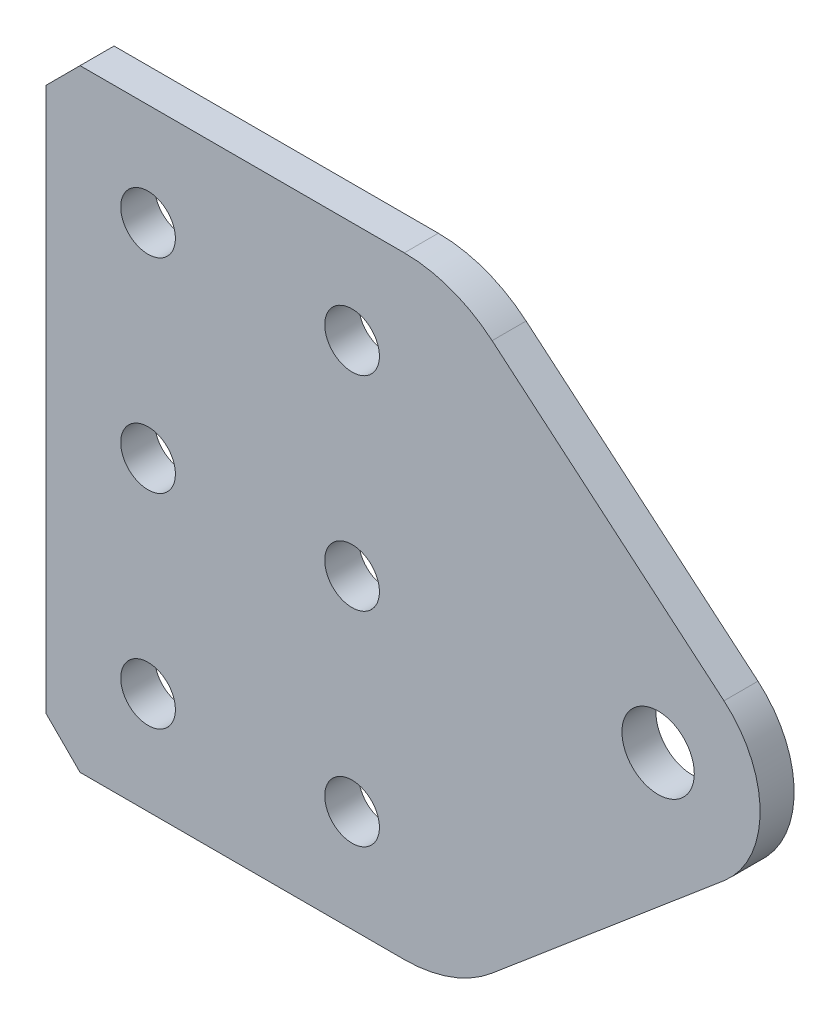
ISO-10303-21;
HEADER;
FILE_DESCRIPTION(('STEP AP214'),'2;1');
FILE_NAME('part.step','',(''),(''),'','','');
FILE_SCHEMA(('AUTOMOTIVE_DESIGN { 1 0 10303 214 1 1 1 1 }'));
ENDSEC;
DATA;
#1=APPLICATION_CONTEXT('core data for automotive mechanical design processes');
#2=APPLICATION_PROTOCOL_DEFINITION('international standard','automotive_design',2000,#1);
#3=PRODUCT_CONTEXT('',#1,'mechanical');
#4=PRODUCT('Part','Part','',(#3));
#5=PRODUCT_RELATED_PRODUCT_CATEGORY('part','',(#4));
#6=PRODUCT_DEFINITION_FORMATION('','',#4);
#7=PRODUCT_DEFINITION_CONTEXT('part definition',#1,'design');
#8=PRODUCT_DEFINITION('design','',#6,#7);
#9=PRODUCT_DEFINITION_SHAPE('','',#8);
#10=(LENGTH_UNIT() NAMED_UNIT(*) SI_UNIT(.MILLI.,.METRE.));
#11=(NAMED_UNIT(*) PLANE_ANGLE_UNIT() SI_UNIT($,.RADIAN.));
#12=(NAMED_UNIT(*) SI_UNIT($,.STERADIAN.) SOLID_ANGLE_UNIT());
#13=UNCERTAINTY_MEASURE_WITH_UNIT(LENGTH_MEASURE(1.E-05),#10,'distance_accuracy_value','');
#14=(GEOMETRIC_REPRESENTATION_CONTEXT(3) GLOBAL_UNCERTAINTY_ASSIGNED_CONTEXT((#13)) GLOBAL_UNIT_ASSIGNED_CONTEXT((#10,
#11,#12)) REPRESENTATION_CONTEXT('',''));
#15=CARTESIAN_POINT('',(0.,0.,0.));
#16=DIRECTION('',(0.,0.,1.));
#17=DIRECTION('',(1.,0.,0.));
#18=AXIS2_PLACEMENT_3D('',#15,#16,#17);
#19=CARTESIAN_POINT('',(33.4514773719376,12.7,3.175));
#20=DIRECTION('',(0.,0.,1.));
#21=DIRECTION('',(1.,0.,0.));
#22=AXIS2_PLACEMENT_3D('',#19,#20,#21);
#23=PLANE('',#22);
#24=CARTESIAN_POINT('',(28.575,28.575,3.175));
#25=DIRECTION('',(0.,0.,1.));
#26=DIRECTION('',(1.,0.,0.));
#27=AXIS2_PLACEMENT_3D('',#24,#25,#26);
#28=CIRCLE('',#27,2.5527);
#29=CARTESIAN_POINT('',(31.1277,28.575,3.175));
#30=VERTEX_POINT('',#29);
#31=EDGE_CURVE('E408',#30,#30,#28,.T.);
#32=ORIENTED_EDGE('',*,*,#31,.F.);
#33=EDGE_LOOP('',(#32));
#34=FACE_BOUND('',#33,.T.);
#35=CARTESIAN_POINT('',(9.525,28.575,3.175));
#36=DIRECTION('',(0.,0.,1.));
#37=DIRECTION('',(1.,0.,0.));
#38=AXIS2_PLACEMENT_3D('',#35,#36,#37);
#39=CIRCLE('',#38,2.5527);
#40=CARTESIAN_POINT('',(12.0777,28.575,3.175));
#41=VERTEX_POINT('',#40);
#42=EDGE_CURVE('E402',#41,#41,#39,.T.);
#43=ORIENTED_EDGE('',*,*,#42,.F.);
#44=EDGE_LOOP('',(#43));
#45=FACE_BOUND('',#44,.T.);
#46=CARTESIAN_POINT('',(9.525,47.625,3.175));
#47=DIRECTION('',(0.,0.,1.));
#48=DIRECTION('',(1.,0.,0.));
#49=AXIS2_PLACEMENT_3D('',#46,#47,#48);
#50=CIRCLE('',#49,2.5527);
#51=CARTESIAN_POINT('',(12.0777,47.625,3.175));
#52=VERTEX_POINT('',#51);
#53=EDGE_CURVE('E405',#52,#52,#50,.T.);
#54=ORIENTED_EDGE('',*,*,#53,.F.);
#55=EDGE_LOOP('',(#54));
#56=FACE_BOUND('',#55,.T.);
#57=CARTESIAN_POINT('',(28.575,47.625,3.175));
#58=DIRECTION('',(0.,0.,1.));
#59=DIRECTION('',(1.,0.,0.));
#60=AXIS2_PLACEMENT_3D('',#57,#58,#59);
#61=CIRCLE('',#60,2.5527);
#62=CARTESIAN_POINT('',(31.1277,47.625,3.175));
#63=VERTEX_POINT('',#62);
#64=EDGE_CURVE('E417',#63,#63,#61,.T.);
#65=ORIENTED_EDGE('',*,*,#64,.F.);
#66=EDGE_LOOP('',(#65));
#67=FACE_BOUND('',#66,.T.);
#68=CARTESIAN_POINT('',(28.575,9.525,3.175));
#69=DIRECTION('',(0.,0.,1.));
#70=DIRECTION('',(1.,0.,0.));
#71=AXIS2_PLACEMENT_3D('',#68,#69,#70);
#72=CIRCLE('',#71,2.5527);
#73=CARTESIAN_POINT('',(31.1277,9.525,3.175));
#74=VERTEX_POINT('',#73);
#75=EDGE_CURVE('E423',#74,#74,#72,.T.);
#76=ORIENTED_EDGE('',*,*,#75,.F.);
#77=EDGE_LOOP('',(#76));
#78=FACE_BOUND('',#77,.T.);
#79=CARTESIAN_POINT('',(9.525,9.525,3.175));
#80=DIRECTION('',(0.,0.,1.));
#81=DIRECTION('',(1.,0.,0.));
#82=AXIS2_PLACEMENT_3D('',#79,#80,#81);
#83=CIRCLE('',#82,2.5527);
#84=CARTESIAN_POINT('',(12.0777,9.525,3.175));
#85=VERTEX_POINT('',#84);
#86=EDGE_CURVE('E429',#85,#85,#83,.T.);
#87=ORIENTED_EDGE('',*,*,#86,.F.);
#88=EDGE_LOOP('',(#87));
#89=FACE_BOUND('',#88,.T.);
#90=DIRECTION('',(0.,-1.,0.));
#91=VECTOR('',#90,1.);
#92=CARTESIAN_POINT('',(0.,57.15,3.175));
#93=LINE('',#92,#91);
#94=CARTESIAN_POINT('',(0.,53.975,3.175));
#95=VERTEX_POINT('',#94);
#96=CARTESIAN_POINT('',(0.,3.17500000000001,3.175));
#97=VERTEX_POINT('',#96);
#98=EDGE_CURVE('E129',#95,#97,#93,.T.);
#99=ORIENTED_EDGE('',*,*,#98,.T.);
#100=DIRECTION('',(-0.707106781186547,0.707106781186548,0.));
#101=VECTOR('',#100,1.);
#102=CARTESIAN_POINT('',(11.9632386859688,-8.7882386859688,3.175));
#103=LINE('',#102,#101);
#104=CARTESIAN_POINT('',(3.175,0.,3.175));
#105=VERTEX_POINT('',#104);
#106=EDGE_CURVE('E49',#97,#105,#103,.F.);
#107=ORIENTED_EDGE('',*,*,#106,.T.);
#108=DIRECTION('',(1.,0.,0.));
#109=VECTOR('',#108,1.);
#110=CARTESIAN_POINT('',(0.,0.,3.175));
#111=LINE('',#110,#109);
#112=CARTESIAN_POINT('',(33.4514773719376,0.,3.175));
#113=VERTEX_POINT('',#112);
#114=EDGE_CURVE('E119',#105,#113,#111,.T.);
#115=ORIENTED_EDGE('',*,*,#114,.T.);
#116=CARTESIAN_POINT('',(33.4514773719376,12.7,3.175));
#117=DIRECTION('',(0.,0.,1.));
#118=DIRECTION('',(1.,0.,0.));
#119=AXIS2_PLACEMENT_3D('',#116,#117,#118);
#120=CIRCLE('',#119,12.7);
#121=CARTESIAN_POINT('',(41.6501136439952,3.00090915196161,3.175));
#122=VERTEX_POINT('',#121);
#123=EDGE_CURVE('E123',#113,#122,#120,.T.);
#124=ORIENTED_EDGE('',*,*,#123,.T.);
#125=DIRECTION('',(0.763707940790424,0.645561911185636,0.));
#126=VECTOR('',#125,1.);
#127=CARTESIAN_POINT('',(41.6501136439952,3.00090915196162,3.175));
#128=LINE('',#127,#126);
#129=CARTESIAN_POINT('',(63.2989772040432,21.3006818639712,3.175));
#130=VERTEX_POINT('',#129);
#131=EDGE_CURVE('E144',#122,#130,#128,.T.);
#132=ORIENTED_EDGE('',*,*,#131,.T.);
#133=CARTESIAN_POINT('',(57.15,28.575,3.175));
#134=DIRECTION('',(0.,0.,1.));
#135=DIRECTION('',(1.,0.,0.));
#136=AXIS2_PLACEMENT_3D('',#133,#134,#135);
#137=CIRCLE('',#136,9.52500000000001);
#138=CARTESIAN_POINT('',(63.2989772040432,35.8493181360288,3.175));
#139=VERTEX_POINT('',#138);
#140=EDGE_CURVE('E146',#130,#139,#137,.T.);
#141=ORIENTED_EDGE('',*,*,#140,.T.);
#142=DIRECTION('',(-0.763707940790424,0.645561911185636,0.));
#143=VECTOR('',#142,1.);
#144=CARTESIAN_POINT('',(63.2989772040432,35.8493181360288,3.175));
#145=LINE('',#144,#143);
#146=CARTESIAN_POINT('',(41.6501136439952,54.1490908480384,3.175));
#147=VERTEX_POINT('',#146);
#148=EDGE_CURVE('E151',#139,#147,#145,.T.);
#149=ORIENTED_EDGE('',*,*,#148,.T.);
#150=CARTESIAN_POINT('',(33.4514773719376,44.45,3.175));
#151=DIRECTION('',(0.,0.,1.));
#152=DIRECTION('',(1.,0.,0.));
#153=AXIS2_PLACEMENT_3D('',#150,#151,#152);
#154=CIRCLE('',#153,12.7);
#155=CARTESIAN_POINT('',(33.4514773719376,57.15,3.175));
#156=VERTEX_POINT('',#155);
#157=EDGE_CURVE('E153',#147,#156,#154,.T.);
#158=ORIENTED_EDGE('',*,*,#157,.T.);
#159=DIRECTION('',(-1.,0.,0.));
#160=VECTOR('',#159,1.);
#161=CARTESIAN_POINT('',(33.4514773719376,57.15,3.175));
#162=LINE('',#161,#160);
#163=CARTESIAN_POINT('',(3.17500000000002,57.15,3.175));
#164=VERTEX_POINT('',#163);
#165=EDGE_CURVE('E155',#156,#164,#162,.T.);
#166=ORIENTED_EDGE('',*,*,#165,.T.);
#167=DIRECTION('',(0.707106781186549,0.707106781186546,0.));
#168=VECTOR('',#167,1.);
#169=CARTESIAN_POINT('',(-3.91176131403111,50.0632386859689,3.175));
#170=LINE('',#169,#168);
#171=EDGE_CURVE('E195',#164,#95,#170,.F.);
#172=ORIENTED_EDGE('',*,*,#171,.T.);
#173=EDGE_LOOP('',(#99,#107,#115,#124,#132,#141,#149,#158,#166,#172));
#174=FACE_BOUND('',#173,.T.);
#175=CARTESIAN_POINT('',(57.15,28.575,3.175));
#176=DIRECTION('',(0.,0.,1.));
#177=DIRECTION('',(1.,0.,0.));
#178=AXIS2_PLACEMENT_3D('',#175,#176,#177);
#179=CIRCLE('',#178,3.3782);
#180=CARTESIAN_POINT('',(60.5282,28.575,3.175));
#181=VERTEX_POINT('',#180);
#182=EDGE_CURVE('E160',#181,#181,#179,.T.);
#183=ORIENTED_EDGE('',*,*,#182,.F.);
#184=EDGE_LOOP('',(#183));
#185=FACE_BOUND('',#184,.T.);
#186=ADVANCED_FACE('F40',(#34,#45,#56,#67,#78,#89,#174,#185),#23,.T.);
#187=CARTESIAN_POINT('',(33.4514773719376,12.7,0.));
#188=DIRECTION('',(0.,0.,1.));
#189=DIRECTION('',(1.,0.,0.));
#190=AXIS2_PLACEMENT_3D('',#187,#188,#189);
#191=PLANE('',#190);
#192=CARTESIAN_POINT('',(28.575,28.575,0.));
#193=DIRECTION('',(0.,0.,1.));
#194=DIRECTION('',(1.,0.,0.));
#195=AXIS2_PLACEMENT_3D('',#192,#193,#194);
#196=CIRCLE('',#195,2.5527);
#197=CARTESIAN_POINT('',(31.1277,28.575,0.));
#198=VERTEX_POINT('',#197);
#199=EDGE_CURVE('E403',#198,#198,#196,.T.);
#200=ORIENTED_EDGE('',*,*,#199,.T.);
#201=EDGE_LOOP('',(#200));
#202=FACE_BOUND('',#201,.T.);
#203=CARTESIAN_POINT('',(9.525,28.575,0.));
#204=DIRECTION('',(0.,0.,1.));
#205=DIRECTION('',(1.,0.,0.));
#206=AXIS2_PLACEMENT_3D('',#203,#204,#205);
#207=CIRCLE('',#206,2.5527);
#208=CARTESIAN_POINT('',(12.0777,28.575,0.));
#209=VERTEX_POINT('',#208);
#210=EDGE_CURVE('E399',#209,#209,#207,.T.);
#211=ORIENTED_EDGE('',*,*,#210,.T.);
#212=EDGE_LOOP('',(#211));
#213=FACE_BOUND('',#212,.T.);
#214=CARTESIAN_POINT('',(9.525,47.625,0.));
#215=DIRECTION('',(0.,0.,1.));
#216=DIRECTION('',(1.,0.,0.));
#217=AXIS2_PLACEMENT_3D('',#214,#215,#216);
#218=CIRCLE('',#217,2.5527);
#219=CARTESIAN_POINT('',(12.0777,47.625,0.));
#220=VERTEX_POINT('',#219);
#221=EDGE_CURVE('E414',#220,#220,#218,.T.);
#222=ORIENTED_EDGE('',*,*,#221,.T.);
#223=EDGE_LOOP('',(#222));
#224=FACE_BOUND('',#223,.T.);
#225=CARTESIAN_POINT('',(28.575,47.625,0.));
#226=DIRECTION('',(0.,0.,1.));
#227=DIRECTION('',(1.,0.,0.));
#228=AXIS2_PLACEMENT_3D('',#225,#226,#227);
#229=CIRCLE('',#228,2.5527);
#230=CARTESIAN_POINT('',(31.1277,47.625,0.));
#231=VERTEX_POINT('',#230);
#232=EDGE_CURVE('E420',#231,#231,#229,.T.);
#233=ORIENTED_EDGE('',*,*,#232,.T.);
#234=EDGE_LOOP('',(#233));
#235=FACE_BOUND('',#234,.T.);
#236=CARTESIAN_POINT('',(28.575,9.525,0.));
#237=DIRECTION('',(0.,0.,1.));
#238=DIRECTION('',(1.,0.,0.));
#239=AXIS2_PLACEMENT_3D('',#236,#237,#238);
#240=CIRCLE('',#239,2.5527);
#241=CARTESIAN_POINT('',(31.1277,9.525,0.));
#242=VERTEX_POINT('',#241);
#243=EDGE_CURVE('E426',#242,#242,#240,.T.);
#244=ORIENTED_EDGE('',*,*,#243,.T.);
#245=EDGE_LOOP('',(#244));
#246=FACE_BOUND('',#245,.T.);
#247=CARTESIAN_POINT('',(9.525,9.525,0.));
#248=DIRECTION('',(0.,0.,1.));
#249=DIRECTION('',(1.,0.,0.));
#250=AXIS2_PLACEMENT_3D('',#247,#248,#249);
#251=CIRCLE('',#250,2.5527);
#252=CARTESIAN_POINT('',(12.0777,9.525,0.));
#253=VERTEX_POINT('',#252);
#254=EDGE_CURVE('E432',#253,#253,#251,.T.);
#255=ORIENTED_EDGE('',*,*,#254,.T.);
#256=EDGE_LOOP('',(#255));
#257=FACE_BOUND('',#256,.T.);
#258=DIRECTION('',(1.,0.,0.));
#259=VECTOR('',#258,1.);
#260=CARTESIAN_POINT('',(0.,0.,0.));
#261=LINE('',#260,#259);
#262=CARTESIAN_POINT('',(3.175,0.,0.));
#263=VERTEX_POINT('',#262);
#264=CARTESIAN_POINT('',(33.4514773719376,0.,0.));
#265=VERTEX_POINT('',#264);
#266=EDGE_CURVE('E135',#263,#265,#261,.T.);
#267=ORIENTED_EDGE('',*,*,#266,.F.);
#268=DIRECTION('',(0.707106781186547,-0.707106781186548,0.));
#269=VECTOR('',#268,1.);
#270=CARTESIAN_POINT('',(3.175,0.,0.));
#271=LINE('',#270,#269);
#272=CARTESIAN_POINT('',(0.,3.17500000000001,0.));
#273=VERTEX_POINT('',#272);
#274=EDGE_CURVE('E189',#263,#273,#271,.F.);
#275=ORIENTED_EDGE('',*,*,#274,.T.);
#276=DIRECTION('',(0.,-1.,0.));
#277=VECTOR('',#276,1.);
#278=CARTESIAN_POINT('',(0.,57.15,0.));
#279=LINE('',#278,#277);
#280=CARTESIAN_POINT('',(0.,53.975,0.));
#281=VERTEX_POINT('',#280);
#282=EDGE_CURVE('E158',#281,#273,#279,.T.);
#283=ORIENTED_EDGE('',*,*,#282,.F.);
#284=DIRECTION('',(-0.707106781186549,-0.707106781186546,0.));
#285=VECTOR('',#284,1.);
#286=CARTESIAN_POINT('',(0.,53.975,0.));
#287=LINE('',#286,#285);
#288=CARTESIAN_POINT('',(3.17500000000002,57.15,0.));
#289=VERTEX_POINT('',#288);
#290=EDGE_CURVE('E187',#281,#289,#287,.F.);
#291=ORIENTED_EDGE('',*,*,#290,.T.);
#292=DIRECTION('',(-1.,0.,0.));
#293=VECTOR('',#292,1.);
#294=CARTESIAN_POINT('',(33.4514773719376,57.15,0.));
#295=LINE('',#294,#293);
#296=CARTESIAN_POINT('',(33.4514773719376,57.15,0.));
#297=VERTEX_POINT('',#296);
#298=EDGE_CURVE('E172',#297,#289,#295,.T.);
#299=ORIENTED_EDGE('',*,*,#298,.F.);
#300=CARTESIAN_POINT('',(33.4514773719376,44.45,0.));
#301=DIRECTION('',(0.,0.,1.));
#302=DIRECTION('',(1.,0.,0.));
#303=AXIS2_PLACEMENT_3D('',#300,#301,#302);
#304=CIRCLE('',#303,12.7);
#305=CARTESIAN_POINT('',(41.6501136439952,54.1490908480384,0.));
#306=VERTEX_POINT('',#305);
#307=EDGE_CURVE('E170',#306,#297,#304,.T.);
#308=ORIENTED_EDGE('',*,*,#307,.F.);
#309=DIRECTION('',(-0.763707940790424,0.645561911185636,0.));
#310=VECTOR('',#309,1.);
#311=CARTESIAN_POINT('',(63.2989772040432,35.8493181360288,0.));
#312=LINE('',#311,#310);
#313=CARTESIAN_POINT('',(63.2989772040432,35.8493181360288,0.));
#314=VERTEX_POINT('',#313);
#315=EDGE_CURVE('E168',#314,#306,#312,.T.);
#316=ORIENTED_EDGE('',*,*,#315,.F.);
#317=CARTESIAN_POINT('',(57.15,28.575,0.));
#318=DIRECTION('',(0.,0.,1.));
#319=DIRECTION('',(1.,0.,0.));
#320=AXIS2_PLACEMENT_3D('',#317,#318,#319);
#321=CIRCLE('',#320,9.52500000000001);
#322=CARTESIAN_POINT('',(63.2989772040432,21.3006818639712,0.));
#323=VERTEX_POINT('',#322);
#324=EDGE_CURVE('E166',#323,#314,#321,.T.);
#325=ORIENTED_EDGE('',*,*,#324,.F.);
#326=DIRECTION('',(0.763707940790424,0.645561911185636,0.));
#327=VECTOR('',#326,1.);
#328=CARTESIAN_POINT('',(41.6501136439952,3.00090915196162,0.));
#329=LINE('',#328,#327);
#330=CARTESIAN_POINT('',(41.6501136439952,3.00090915196161,0.));
#331=VERTEX_POINT('',#330);
#332=EDGE_CURVE('E164',#331,#323,#329,.T.);
#333=ORIENTED_EDGE('',*,*,#332,.F.);
#334=CARTESIAN_POINT('',(33.4514773719376,12.7,0.));
#335=DIRECTION('',(0.,0.,1.));
#336=DIRECTION('',(1.,0.,0.));
#337=AXIS2_PLACEMENT_3D('',#334,#335,#336);
#338=CIRCLE('',#337,12.7);
#339=EDGE_CURVE('E162',#265,#331,#338,.T.);
#340=ORIENTED_EDGE('',*,*,#339,.F.);
#341=EDGE_LOOP('',(#267,#275,#283,#291,#299,#308,#316,#325,#333,#340));
#342=FACE_BOUND('',#341,.T.);
#343=CARTESIAN_POINT('',(57.15,28.575,0.));
#344=DIRECTION('',(0.,0.,1.));
#345=DIRECTION('',(1.,0.,0.));
#346=AXIS2_PLACEMENT_3D('',#343,#344,#345);
#347=CIRCLE('',#346,3.3782);
#348=CARTESIAN_POINT('',(60.5282,28.575,0.));
#349=VERTEX_POINT('',#348);
#350=EDGE_CURVE('E435',#349,#349,#347,.T.);
#351=ORIENTED_EDGE('',*,*,#350,.T.);
#352=EDGE_LOOP('',(#351));
#353=FACE_BOUND('',#352,.T.);
#354=ADVANCED_FACE('F203',(#202,#213,#224,#235,#246,#257,#342,#353),#191,.F.);
#355=CARTESIAN_POINT('',(0.,57.15,3.175));
#356=DIRECTION('',(1.,0.,0.));
#357=DIRECTION('',(0.,0.,-1.));
#358=AXIS2_PLACEMENT_3D('',#355,#356,#357);
#359=PLANE('',#358);
#360=ORIENTED_EDGE('',*,*,#282,.T.);
#361=DIRECTION('',(0.,0.,1.));
#362=VECTOR('',#361,1.);
#363=CARTESIAN_POINT('',(0.,3.17500000000001,3.175));
#364=LINE('',#363,#362);
#365=EDGE_CURVE('E62',#273,#97,#364,.T.);
#366=ORIENTED_EDGE('',*,*,#365,.T.);
#367=ORIENTED_EDGE('',*,*,#98,.F.);
#368=DIRECTION('',(0.,0.,-1.));
#369=VECTOR('',#368,1.);
#370=CARTESIAN_POINT('',(0.,53.975,3.175));
#371=LINE('',#370,#369);
#372=EDGE_CURVE('E191',#95,#281,#371,.T.);
#373=ORIENTED_EDGE('',*,*,#372,.T.);
#374=EDGE_LOOP('',(#360,#366,#367,#373));
#375=FACE_BOUND('',#374,.T.);
#376=ADVANCED_FACE('F199',(#375),#359,.F.);
#377=CARTESIAN_POINT('',(0.,0.,3.175));
#378=DIRECTION('',(0.,1.,0.));
#379=DIRECTION('',(0.,0.,1.));
#380=AXIS2_PLACEMENT_3D('',#377,#378,#379);
#381=PLANE('',#380);
#382=ORIENTED_EDGE('',*,*,#114,.F.);
#383=DIRECTION('',(0.,0.,-1.));
#384=VECTOR('',#383,1.);
#385=CARTESIAN_POINT('',(3.175,0.,3.175));
#386=LINE('',#385,#384);
#387=EDGE_CURVE('E138',#105,#263,#386,.T.);
#388=ORIENTED_EDGE('',*,*,#387,.T.);
#389=ORIENTED_EDGE('',*,*,#266,.T.);
#390=DIRECTION('',(0.,0.,-1.));
#391=VECTOR('',#390,1.);
#392=CARTESIAN_POINT('',(33.4514773719376,0.,3.175));
#393=LINE('',#392,#391);
#394=EDGE_CURVE('E132',#113,#265,#393,.T.);
#395=ORIENTED_EDGE('',*,*,#394,.F.);
#396=EDGE_LOOP('',(#382,#388,#389,#395));
#397=FACE_BOUND('',#396,.T.);
#398=ADVANCED_FACE('F133',(#397),#381,.F.);
#399=CARTESIAN_POINT('',(33.4514773719376,12.7,3.175));
#400=DIRECTION('',(0.,0.,-1.));
#401=DIRECTION('',(-1.,0.,0.));
#402=AXIS2_PLACEMENT_3D('',#399,#400,#401);
#403=CYLINDRICAL_SURFACE('',#402,12.7);
#404=ORIENTED_EDGE('',*,*,#339,.T.);
#405=DIRECTION('',(0.,0.,-1.));
#406=VECTOR('',#405,1.);
#407=CARTESIAN_POINT('',(41.6501136439952,3.00090915196161,3.175));
#408=LINE('',#407,#406);
#409=EDGE_CURVE('E139',#122,#331,#408,.T.);
#410=ORIENTED_EDGE('',*,*,#409,.F.);
#411=ORIENTED_EDGE('',*,*,#123,.F.);
#412=ORIENTED_EDGE('',*,*,#394,.T.);
#413=EDGE_LOOP('',(#404,#410,#411,#412));
#414=FACE_BOUND('',#413,.T.);
#415=ADVANCED_FACE('F141',(#414),#403,.T.);
#416=CARTESIAN_POINT('',(41.6501136439952,3.00090915196162,3.175));
#417=DIRECTION('',(-0.645561911185636,0.763707940790424,0.));
#418=DIRECTION('',(-0.763707940790424,-0.645561911185636,0.));
#419=AXIS2_PLACEMENT_3D('',#416,#417,#418);
#420=PLANE('',#419);
#421=ORIENTED_EDGE('',*,*,#332,.T.);
#422=DIRECTION('',(0.,0.,-1.));
#423=VECTOR('',#422,1.);
#424=CARTESIAN_POINT('',(63.2989772040432,21.3006818639712,3.175));
#425=LINE('',#424,#423);
#426=EDGE_CURVE('E182',#130,#323,#425,.T.);
#427=ORIENTED_EDGE('',*,*,#426,.F.);
#428=ORIENTED_EDGE('',*,*,#131,.F.);
#429=ORIENTED_EDGE('',*,*,#409,.T.);
#430=EDGE_LOOP('',(#421,#427,#428,#429));
#431=FACE_BOUND('',#430,.T.);
#432=ADVANCED_FACE('F224',(#431),#420,.F.);
#433=CARTESIAN_POINT('',(57.15,28.575,3.175));
#434=DIRECTION('',(0.,0.,-1.));
#435=DIRECTION('',(-1.,0.,0.));
#436=AXIS2_PLACEMENT_3D('',#433,#434,#435);
#437=CYLINDRICAL_SURFACE('',#436,9.52500000000001);
#438=ORIENTED_EDGE('',*,*,#324,.T.);
#439=DIRECTION('',(0.,0.,-1.));
#440=VECTOR('',#439,1.);
#441=CARTESIAN_POINT('',(63.2989772040432,35.8493181360288,3.175));
#442=LINE('',#441,#440);
#443=EDGE_CURVE('E179',#139,#314,#442,.T.);
#444=ORIENTED_EDGE('',*,*,#443,.F.);
#445=ORIENTED_EDGE('',*,*,#140,.F.);
#446=ORIENTED_EDGE('',*,*,#426,.T.);
#447=EDGE_LOOP('',(#438,#444,#445,#446));
#448=FACE_BOUND('',#447,.T.);
#449=ADVANCED_FACE('F221',(#448),#437,.T.);
#450=CARTESIAN_POINT('',(63.2989772040432,35.8493181360288,3.175));
#451=DIRECTION('',(-0.645561911185636,-0.763707940790424,0.));
#452=DIRECTION('',(0.763707940790424,-0.645561911185636,0.));
#453=AXIS2_PLACEMENT_3D('',#450,#451,#452);
#454=PLANE('',#453);
#455=ORIENTED_EDGE('',*,*,#315,.T.);
#456=DIRECTION('',(0.,0.,-1.));
#457=VECTOR('',#456,1.);
#458=CARTESIAN_POINT('',(41.6501136439952,54.1490908480384,3.175));
#459=LINE('',#458,#457);
#460=EDGE_CURVE('E176',#147,#306,#459,.T.);
#461=ORIENTED_EDGE('',*,*,#460,.F.);
#462=ORIENTED_EDGE('',*,*,#148,.F.);
#463=ORIENTED_EDGE('',*,*,#443,.T.);
#464=EDGE_LOOP('',(#455,#461,#462,#463));
#465=FACE_BOUND('',#464,.T.);
#466=ADVANCED_FACE('F216',(#465),#454,.F.);
#467=CARTESIAN_POINT('',(33.4514773719376,44.45,3.175));
#468=DIRECTION('',(0.,0.,-1.));
#469=DIRECTION('',(-1.,0.,0.));
#470=AXIS2_PLACEMENT_3D('',#467,#468,#469);
#471=CYLINDRICAL_SURFACE('',#470,12.7);
#472=ORIENTED_EDGE('',*,*,#307,.T.);
#473=DIRECTION('',(0.,0.,-1.));
#474=VECTOR('',#473,1.);
#475=CARTESIAN_POINT('',(33.4514773719376,57.15,3.175));
#476=LINE('',#475,#474);
#477=EDGE_CURVE('E157',#156,#297,#476,.T.);
#478=ORIENTED_EDGE('',*,*,#477,.F.);
#479=ORIENTED_EDGE('',*,*,#157,.F.);
#480=ORIENTED_EDGE('',*,*,#460,.T.);
#481=EDGE_LOOP('',(#472,#478,#479,#480));
#482=FACE_BOUND('',#481,.T.);
#483=ADVANCED_FACE('F210',(#482),#471,.T.);
#484=CARTESIAN_POINT('',(33.4514773719376,57.15,3.175));
#485=DIRECTION('',(0.,-1.,0.));
#486=DIRECTION('',(0.,0.,-1.));
#487=AXIS2_PLACEMENT_3D('',#484,#485,#486);
#488=PLANE('',#487);
#489=ORIENTED_EDGE('',*,*,#298,.T.);
#490=DIRECTION('',(0.,0.,1.));
#491=VECTOR('',#490,1.);
#492=CARTESIAN_POINT('',(3.17500000000002,57.15,3.175));
#493=LINE('',#492,#491);
#494=EDGE_CURVE('E11',#289,#164,#493,.T.);
#495=ORIENTED_EDGE('',*,*,#494,.T.);
#496=ORIENTED_EDGE('',*,*,#165,.F.);
#497=ORIENTED_EDGE('',*,*,#477,.T.);
#498=EDGE_LOOP('',(#489,#495,#496,#497));
#499=FACE_BOUND('',#498,.T.);
#500=ADVANCED_FACE('F206',(#499),#488,.F.);
#501=CARTESIAN_POINT('',(57.15,28.575,3.175));
#502=DIRECTION('',(0.,0.,-1.));
#503=DIRECTION('',(-1.,0.,0.));
#504=AXIS2_PLACEMENT_3D('',#501,#502,#503);
#505=CYLINDRICAL_SURFACE('',#504,3.3782);
#506=ORIENTED_EDGE('',*,*,#182,.T.);
#507=EDGE_LOOP('',(#506));
#508=FACE_BOUND('',#507,.T.);
#509=ORIENTED_EDGE('',*,*,#350,.F.);
#510=EDGE_LOOP('',(#509));
#511=FACE_BOUND('',#510,.T.);
#512=ADVANCED_FACE('F249',(#508,#511),#505,.F.);
#513=CARTESIAN_POINT('',(9.525,9.525,3.175));
#514=DIRECTION('',(0.,0.,1.));
#515=DIRECTION('',(1.,0.,0.));
#516=AXIS2_PLACEMENT_3D('',#513,#514,#515);
#517=CYLINDRICAL_SURFACE('',#516,2.5527);
#518=ORIENTED_EDGE('',*,*,#254,.F.);
#519=EDGE_LOOP('',(#518));
#520=FACE_BOUND('',#519,.T.);
#521=ORIENTED_EDGE('',*,*,#86,.T.);
#522=EDGE_LOOP('',(#521));
#523=FACE_BOUND('',#522,.T.);
#524=ADVANCED_FACE('F304',(#520,#523),#517,.F.);
#525=CARTESIAN_POINT('',(28.575,9.525,3.175));
#526=DIRECTION('',(0.,0.,1.));
#527=DIRECTION('',(1.,0.,0.));
#528=AXIS2_PLACEMENT_3D('',#525,#526,#527);
#529=CYLINDRICAL_SURFACE('',#528,2.5527);
#530=ORIENTED_EDGE('',*,*,#243,.F.);
#531=EDGE_LOOP('',(#530));
#532=FACE_BOUND('',#531,.T.);
#533=ORIENTED_EDGE('',*,*,#75,.T.);
#534=EDGE_LOOP('',(#533));
#535=FACE_BOUND('',#534,.T.);
#536=ADVANCED_FACE('F311',(#532,#535),#529,.F.);
#537=CARTESIAN_POINT('',(28.575,47.625,3.175));
#538=DIRECTION('',(0.,0.,1.));
#539=DIRECTION('',(1.,0.,0.));
#540=AXIS2_PLACEMENT_3D('',#537,#538,#539);
#541=CYLINDRICAL_SURFACE('',#540,2.5527);
#542=ORIENTED_EDGE('',*,*,#232,.F.);
#543=EDGE_LOOP('',(#542));
#544=FACE_BOUND('',#543,.T.);
#545=ORIENTED_EDGE('',*,*,#64,.T.);
#546=EDGE_LOOP('',(#545));
#547=FACE_BOUND('',#546,.T.);
#548=ADVANCED_FACE('F318',(#544,#547),#541,.F.);
#549=CARTESIAN_POINT('',(9.525,47.625,3.175));
#550=DIRECTION('',(0.,0.,1.));
#551=DIRECTION('',(1.,0.,0.));
#552=AXIS2_PLACEMENT_3D('',#549,#550,#551);
#553=CYLINDRICAL_SURFACE('',#552,2.5527);
#554=ORIENTED_EDGE('',*,*,#221,.F.);
#555=EDGE_LOOP('',(#554));
#556=FACE_BOUND('',#555,.T.);
#557=ORIENTED_EDGE('',*,*,#53,.T.);
#558=EDGE_LOOP('',(#557));
#559=FACE_BOUND('',#558,.T.);
#560=ADVANCED_FACE('F326',(#556,#559),#553,.F.);
#561=CARTESIAN_POINT('',(9.525,28.575,3.175));
#562=DIRECTION('',(0.,0.,1.));
#563=DIRECTION('',(1.,0.,0.));
#564=AXIS2_PLACEMENT_3D('',#561,#562,#563);
#565=CYLINDRICAL_SURFACE('',#564,2.5527);
#566=ORIENTED_EDGE('',*,*,#210,.F.);
#567=EDGE_LOOP('',(#566));
#568=FACE_BOUND('',#567,.T.);
#569=ORIENTED_EDGE('',*,*,#42,.T.);
#570=EDGE_LOOP('',(#569));
#571=FACE_BOUND('',#570,.T.);
#572=ADVANCED_FACE('F233',(#568,#571),#565,.F.);
#573=CARTESIAN_POINT('',(28.575,28.575,3.175));
#574=DIRECTION('',(0.,0.,1.));
#575=DIRECTION('',(1.,0.,0.));
#576=AXIS2_PLACEMENT_3D('',#573,#574,#575);
#577=CYLINDRICAL_SURFACE('',#576,2.5527);
#578=ORIENTED_EDGE('',*,*,#199,.F.);
#579=EDGE_LOOP('',(#578));
#580=FACE_BOUND('',#579,.T.);
#581=ORIENTED_EDGE('',*,*,#31,.T.);
#582=EDGE_LOOP('',(#581));
#583=FACE_BOUND('',#582,.T.);
#584=ADVANCED_FACE('F228',(#580,#583),#577,.F.);
#585=CARTESIAN_POINT('',(3.175,0.,3.175));
#586=DIRECTION('',(0.707106781186548,0.707106781186547,0.));
#587=DIRECTION('',(0.,0.,-1.));
#588=AXIS2_PLACEMENT_3D('',#585,#586,#587);
#589=PLANE('',#588);
#590=ORIENTED_EDGE('',*,*,#106,.F.);
#591=ORIENTED_EDGE('',*,*,#365,.F.);
#592=ORIENTED_EDGE('',*,*,#274,.F.);
#593=ORIENTED_EDGE('',*,*,#387,.F.);
#594=EDGE_LOOP('',(#590,#591,#592,#593));
#595=FACE_BOUND('',#594,.T.);
#596=ADVANCED_FACE('F226',(#595),#589,.F.);
#597=CARTESIAN_POINT('',(0.,53.975,3.175));
#598=DIRECTION('',(0.707106781186546,-0.707106781186549,0.));
#599=DIRECTION('',(0.,0.,-1.));
#600=AXIS2_PLACEMENT_3D('',#597,#598,#599);
#601=PLANE('',#600);
#602=ORIENTED_EDGE('',*,*,#171,.F.);
#603=ORIENTED_EDGE('',*,*,#494,.F.);
#604=ORIENTED_EDGE('',*,*,#290,.F.);
#605=ORIENTED_EDGE('',*,*,#372,.F.);
#606=EDGE_LOOP('',(#602,#603,#604,#605));
#607=FACE_BOUND('',#606,.T.);
#608=ADVANCED_FACE('F43',(#607),#601,.F.);
#609=CLOSED_SHELL('',(#186,#354,#376,#398,#415,#432,#449,#466,#483,#500,#512,#524,#536,#548,
#560,#572,#584,#596,#608));
#610=MANIFOLD_SOLID_BREP('B2',#609);
#611=ADVANCED_BREP_SHAPE_REPRESENTATION('',(#18,#610),#14);
#612=SHAPE_DEFINITION_REPRESENTATION(#9,#611);
ENDSEC;
END-ISO-10303-21;
